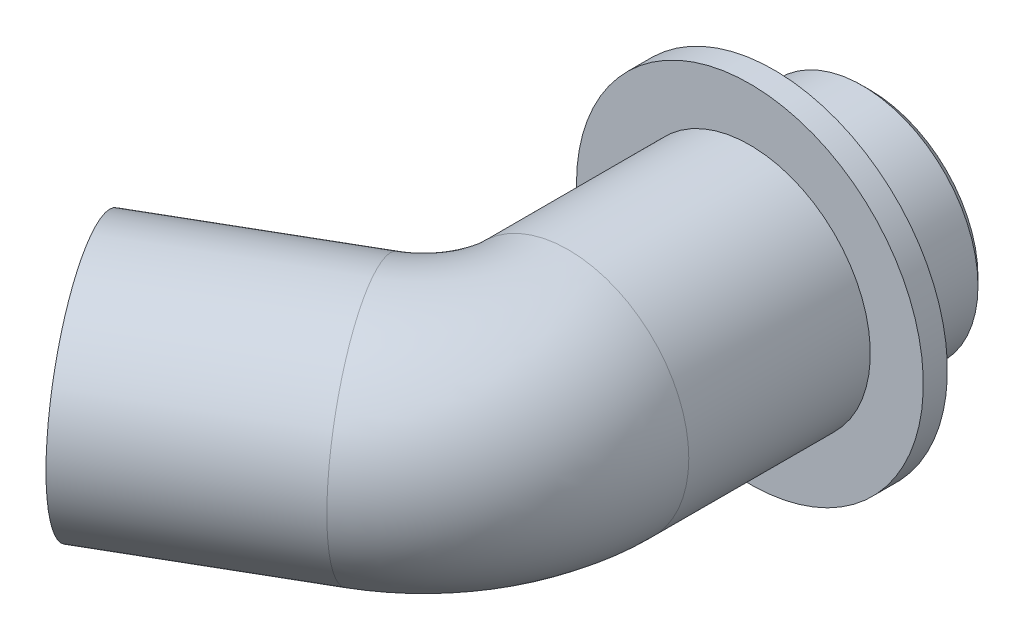
ISO-10303-21;
HEADER;
FILE_DESCRIPTION(('STEP AP214'),'2;1');
FILE_NAME('part.step','',(''),(''),'','','');
FILE_SCHEMA(('AUTOMOTIVE_DESIGN { 1 0 10303 214 1 1 1 1 }'));
ENDSEC;
DATA;
#1=APPLICATION_CONTEXT('core data for automotive mechanical design processes');
#2=APPLICATION_PROTOCOL_DEFINITION('international standard','automotive_design',2000,#1);
#3=PRODUCT_CONTEXT('',#1,'mechanical');
#4=PRODUCT('Part','Part','',(#3));
#5=PRODUCT_RELATED_PRODUCT_CATEGORY('part','',(#4));
#6=PRODUCT_DEFINITION_FORMATION('','',#4);
#7=PRODUCT_DEFINITION_CONTEXT('part definition',#1,'design');
#8=PRODUCT_DEFINITION('design','',#6,#7);
#9=PRODUCT_DEFINITION_SHAPE('','',#8);
#10=(LENGTH_UNIT() NAMED_UNIT(*) SI_UNIT(.MILLI.,.METRE.));
#11=(NAMED_UNIT(*) PLANE_ANGLE_UNIT() SI_UNIT($,.RADIAN.));
#12=(NAMED_UNIT(*) SI_UNIT($,.STERADIAN.) SOLID_ANGLE_UNIT());
#13=UNCERTAINTY_MEASURE_WITH_UNIT(LENGTH_MEASURE(1.E-05),#10,'distance_accuracy_value','');
#14=(GEOMETRIC_REPRESENTATION_CONTEXT(3) GLOBAL_UNCERTAINTY_ASSIGNED_CONTEXT((#13)) GLOBAL_UNIT_ASSIGNED_CONTEXT((#10,
#11,#12)) REPRESENTATION_CONTEXT('',''));
#15=CARTESIAN_POINT('',(0.,0.,0.));
#16=DIRECTION('',(0.,0.,1.));
#17=DIRECTION('',(1.,0.,0.));
#18=AXIS2_PLACEMENT_3D('',#15,#16,#17);
#19=CARTESIAN_POINT('',(0.,0.,0.));
#20=DIRECTION('',(0.,0.,0.999999999999976));
#21=DIRECTION('',(0.999999999999988,0.,0.));
#22=AXIS2_PLACEMENT_3D('',#19,#20,#21);
#23=PLANE('',#22);
#24=CARTESIAN_POINT('',(0.,0.,0.));
#25=DIRECTION('',(0.,0.,0.999999999999976));
#26=DIRECTION('',(0.999999999999988,0.,0.));
#27=AXIS2_PLACEMENT_3D('',#24,#25,#26);
#28=CIRCLE('',#27,22.352);
#29=CARTESIAN_POINT('',(22.3519999999997,0.,0.));
#30=VERTEX_POINT('',#29);
#31=EDGE_CURVE('E53',#30,#30,#28,.F.);
#32=ORIENTED_EDGE('',*,*,#31,.T.);
#33=EDGE_LOOP('',(#32));
#34=FACE_BOUND('',#33,.T.);
#35=CARTESIAN_POINT('',(0.,0.,0.));
#36=DIRECTION('',(0.,0.,0.999999999999976));
#37=DIRECTION('',(0.999999999999988,0.,0.));
#38=AXIS2_PLACEMENT_3D('',#35,#36,#37);
#39=CIRCLE('',#38,15.);
#40=CARTESIAN_POINT('',(14.9999999999998,0.,0.));
#41=VERTEX_POINT('',#40);
#42=EDGE_CURVE('E76',#41,#41,#39,.T.);
#43=ORIENTED_EDGE('',*,*,#42,.T.);
#44=EDGE_LOOP('',(#43));
#45=FACE_BOUND('',#44,.T.);
#46=ADVANCED_FACE('F46',(#34,#45),#23,.F.);
#47=CARTESIAN_POINT('',(22.,0.,15.9999999999992));
#48=DIRECTION('',(0.,0.,0.999999999999976));
#49=DIRECTION('',(0.999999999999988,0.,0.));
#50=AXIS2_PLACEMENT_3D('',#47,#48,#49);
#51=PLANE('',#50);
#52=CARTESIAN_POINT('',(5.48172618408671E-13,0.,16.));
#53=DIRECTION('',(0.,0.,-0.999999999999976));
#54=DIRECTION('',(-0.999999999999988,0.,0.));
#55=AXIS2_PLACEMENT_3D('',#52,#53,#54);
#56=CIRCLE('',#55,22.);
#57=CARTESIAN_POINT('',(-21.9999999999997,0.,16.));
#58=VERTEX_POINT('',#57);
#59=EDGE_CURVE('E93',#58,#58,#56,.T.);
#60=ORIENTED_EDGE('',*,*,#59,.T.);
#61=EDGE_LOOP('',(#60));
#62=FACE_BOUND('',#61,.T.);
#63=CARTESIAN_POINT('',(5.48172618408671E-13,0.,16.));
#64=DIRECTION('',(0.,0.,0.999999999999976));
#65=DIRECTION('',(0.999999999999988,0.,0.));
#66=AXIS2_PLACEMENT_3D('',#63,#64,#65);
#67=CIRCLE('',#66,24.);
#68=CARTESIAN_POINT('',(-23.9999999999997,0.,16.));
#69=VERTEX_POINT('',#68);
#70=EDGE_CURVE('E96',#69,#69,#67,.F.);
#71=ORIENTED_EDGE('',*,*,#70,.F.);
#72=EDGE_LOOP('',(#71));
#73=FACE_BOUND('',#72,.T.);
#74=ADVANCED_FACE('F102',(#62,#73),#51,.T.);
#75=CARTESIAN_POINT('',(5.55111512312578E-13,0.,62.6794919243098));
#76=DIRECTION('',(0.,0.,-0.999999999999976));
#77=DIRECTION('',(-0.999999999999988,0.,0.));
#78=AXIS2_PLACEMENT_3D('',#75,#76,#77);
#79=CYLINDRICAL_SURFACE('',#78,25.);
#80=CARTESIAN_POINT('',(5.55111512312578E-13,0.,62.6794919243098));
#81=DIRECTION('',(0.,0.,0.999999999999976));
#82=DIRECTION('',(0.999999999999988,0.,0.));
#83=AXIS2_PLACEMENT_3D('',#80,#81,#82);
#84=CIRCLE('',#83,25.);
#85=CARTESIAN_POINT('',(25.0000000000007,0.,62.679491924311));
#86=VERTEX_POINT('',#85);
#87=EDGE_CURVE('E75',#86,#86,#84,.T.);
#88=ORIENTED_EDGE('',*,*,#87,.F.);
#89=EDGE_LOOP('',(#88));
#90=FACE_BOUND('',#89,.T.);
#91=CARTESIAN_POINT('',(5.48172618408671E-13,0.,24.9999999999985));
#92=DIRECTION('',(0.,0.,-0.999999999999976));
#93=DIRECTION('',(-0.999999999999988,0.,0.));
#94=AXIS2_PLACEMENT_3D('',#91,#92,#93);
#95=CIRCLE('',#94,25.);
#96=CARTESIAN_POINT('',(-24.9999999999991,0.,24.9999999999985));
#97=VERTEX_POINT('',#96);
#98=EDGE_CURVE('E57',#97,#97,#95,.T.);
#99=ORIENTED_EDGE('',*,*,#98,.F.);
#100=EDGE_LOOP('',(#99));
#101=FACE_BOUND('',#100,.T.);
#102=ADVANCED_FACE('F104',(#90,#101),#79,.T.);
#103=CARTESIAN_POINT('',(-14.9999999999996,0.,88.6602540378429));
#104=DIRECTION('',(-0.866025403784426,0.,0.499999999999989));
#105=DIRECTION('',(0.499999999999994,0.,0.866025403784413));
#106=AXIS2_PLACEMENT_3D('',#103,#104,#105);
#107=CYLINDRICAL_SURFACE('',#106,25.);
#108=CARTESIAN_POINT('',(-14.9999999999996,0.,88.6602540378429));
#109=DIRECTION('',(-0.866025403784426,0.,0.499999999999989));
#110=DIRECTION('',(0.499999999999994,0.,0.866025403784413));
#111=AXIS2_PLACEMENT_3D('',#108,#109,#110);
#112=CIRCLE('',#111,25.);
#113=CARTESIAN_POINT('',(-2.49999999999993,0.,110.310889132453));
#114=VERTEX_POINT('',#113);
#115=EDGE_CURVE('E69',#114,#114,#112,.T.);
#116=CARTESIAN_POINT('',(-51.9615242270655,0.,109.999999999997));
#117=DIRECTION('',(-0.866025403784426,0.,0.499999999999989));
#118=DIRECTION('',(0.499999999999994,0.,0.866025403784413));
#119=AXIS2_PLACEMENT_3D('',#116,#117,#118);
#120=CIRCLE('',#119,25.);
#121=CARTESIAN_POINT('',(-39.4615242270654,0.,131.650635094608));
#122=VERTEX_POINT('',#121);
#123=EDGE_CURVE('E61',#122,#122,#120,.T.);
#124=CARTESIAN_POINT('',(-2.49999999999993,0.,110.310889132453));
#125=CARTESIAN_POINT('',(-2.8850158773652,0.,110.533178152892));
#126=CARTESIAN_POINT('',(-3.27003175473046,0.,110.755467173332));
#127=CARTESIAN_POINT('',(-4.040063509461,0.,111.20004521421));
#128=CARTESIAN_POINT('',(-4.42507938682626,0.,111.422334234649));
#129=CARTESIAN_POINT('',(-5.19511114155679,0.,111.866912275527));
#130=CARTESIAN_POINT('',(-5.58012701892206,0.,112.089201295966));
#131=CARTESIAN_POINT('',(-6.35015877365259,0.,112.533779336844));
#132=CARTESIAN_POINT('',(-6.73517465101785,0.,112.756068357284));
#133=CARTESIAN_POINT('',(-7.50520640574838,0.,113.200646398162));
#134=CARTESIAN_POINT('',(-7.89022228311365,0.,113.422935418601));
#135=CARTESIAN_POINT('',(-8.66025403784418,0.,113.867513459479));
#136=CARTESIAN_POINT('',(-9.04526991520945,0.,114.089802479918));
#137=CARTESIAN_POINT('',(-9.81530166993998,0.,114.534380520796));
#138=CARTESIAN_POINT('',(-10.2003175473052,0.,114.756669541236));
#139=CARTESIAN_POINT('',(-10.9703493020358,0.,115.201247582114));
#140=CARTESIAN_POINT('',(-11.355365179401,0.,115.423536602553));
#141=CARTESIAN_POINT('',(-12.1253969341316,0.,115.868114643431));
#142=CARTESIAN_POINT('',(-12.5104128114968,0.,116.09040366387));
#143=CARTESIAN_POINT('',(-13.2804445662274,0.,116.534981704749));
#144=CARTESIAN_POINT('',(-13.6654604435926,0.,116.757270725188));
#145=CARTESIAN_POINT('',(-14.4354921983232,0.,117.201848766066));
#146=CARTESIAN_POINT('',(-14.8205080756884,0.,117.424137786505));
#147=CARTESIAN_POINT('',(-15.590539830419,0.,117.868715827383));
#148=CARTESIAN_POINT('',(-15.9755557077842,0.,118.091004847822));
#149=CARTESIAN_POINT('',(-16.7455874625148,0.,118.535582888701));
#150=CARTESIAN_POINT('',(-17.13060333988,0.,118.75787190914));
#151=CARTESIAN_POINT('',(-17.9006350946106,0.,119.202449950018));
#152=CARTESIAN_POINT('',(-18.2856509719758,0.,119.424738970457));
#153=CARTESIAN_POINT('',(-19.0556827267063,0.,119.869317011335));
#154=CARTESIAN_POINT('',(-19.4406986040716,0.,120.091606031774));
#155=CARTESIAN_POINT('',(-20.2107303588021,0.,120.536184072653));
#156=CARTESIAN_POINT('',(-20.5957462361674,0.,120.758473093092));
#157=CARTESIAN_POINT('',(-21.3657779908979,0.,121.20305113397));
#158=CARTESIAN_POINT('',(-21.7507938682632,0.,121.425340154409));
#159=CARTESIAN_POINT('',(-22.5208256229937,0.,121.869918195287));
#160=CARTESIAN_POINT('',(-22.905841500359,0.,122.092207215726));
#161=CARTESIAN_POINT('',(-23.6758732550895,0.,122.536785256605));
#162=CARTESIAN_POINT('',(-24.0608891324548,0.,122.759074277044));
#163=CARTESIAN_POINT('',(-24.8309208871853,0.,123.203652317922));
#164=CARTESIAN_POINT('',(-25.2159367645506,0.,123.425941338361));
#165=CARTESIAN_POINT('',(-25.9859685192811,0.,123.870519379239));
#166=CARTESIAN_POINT('',(-26.3709843966464,0.,124.092808399678));
#167=CARTESIAN_POINT('',(-27.1410161513769,0.,124.537386440557));
#168=CARTESIAN_POINT('',(-27.5260320287422,0.,124.759675460996));
#169=CARTESIAN_POINT('',(-28.2960637834727,0.,125.204253501874));
#170=CARTESIAN_POINT('',(-28.681079660838,0.,125.426542522313));
#171=CARTESIAN_POINT('',(-29.4511114155685,0.,125.871120563191));
#172=CARTESIAN_POINT('',(-29.8361272929338,0.,126.09340958363));
#173=CARTESIAN_POINT('',(-30.6061590476643,0.,126.537987624509));
#174=CARTESIAN_POINT('',(-30.9911749250296,0.,126.760276644948));
#175=CARTESIAN_POINT('',(-31.7612066797601,0.,127.204854685826));
#176=CARTESIAN_POINT('',(-32.1462225571254,0.,127.427143706265));
#177=CARTESIAN_POINT('',(-32.9162543118559,0.,127.871721747143));
#178=CARTESIAN_POINT('',(-33.3012701892212,0.,128.094010767582));
#179=CARTESIAN_POINT('',(-34.0713019439517,0.,128.538588808461));
#180=CARTESIAN_POINT('',(-34.456317821317,0.,128.7608778289));
#181=CARTESIAN_POINT('',(-35.2263495760475,0.,129.205455869778));
#182=CARTESIAN_POINT('',(-35.6113654534128,0.,129.427744890217));
#183=CARTESIAN_POINT('',(-36.3813972081433,0.,129.872322931095));
#184=CARTESIAN_POINT('',(-36.7664130855086,0.,130.094611951535));
#185=CARTESIAN_POINT('',(-37.5364448402391,0.,130.539189992413));
#186=CARTESIAN_POINT('',(-37.9214607176043,0.,130.761479012852));
#187=CARTESIAN_POINT('',(-38.6914924723349,0.,131.20605705373));
#188=CARTESIAN_POINT('',(-39.0765083497002,0.,131.428346074169));
#189=CARTESIAN_POINT('',(-39.4615242270654,0.,131.650635094608));
#190=B_SPLINE_CURVE_WITH_KNOTS('',3,(#124,#125,#126,#127,#128,#129,#130,#131,#132,#133,#134,
#135,#136,#137,#138,#139,#140,#141,#142,#143,#144,#145,#146,#147,#148,#149,#150,#151,#152,#153,
#154,#155,#156,#157,#158,#159,#160,#161,#162,#163,#164,#165,#166,#167,#168,#169,#170,#171,#172,
#173,#174,#175,#176,#177,#178,#179,#180,#181,#182,#183,#184,#185,#186,#187,#188,#189),
.UNSPECIFIED.,.F.,.F.,(4,2,2,2,2,2,2,2,2,2,2,2,2,2,2,2,2,2,2,2,2,2,2,2,2,2,2,2,2,2,2,2,4),(0.,
1.33373412263469,2.66746824526938,4.00120236790408,5.33493649053877,6.66867061317347,
8.00240473580816,9.33613885844286,10.6698729810775,12.0036071037122,13.3373412263469,
14.6710753489816,16.0048094716163,17.338543594251,18.6722777168857,20.0060118395204,
21.3397459621551,22.6734800847898,24.0072142074245,25.3409483300592,26.6746824526939,
28.0084165753286,29.3421506979633,30.675884820598,32.0096189432326,33.3433530658673,
34.677087188502,36.0108213111367,37.3445554337714,38.6782895564061,40.0120236790408,
41.3457578016755,42.6794919243102),.UNSPECIFIED.);
#191=EDGE_CURVE('BSEAM111',#114,#122,#190,.T.);
#192=ORIENTED_EDGE('',*,*,#115,.T.);
#193=ORIENTED_EDGE('',*,*,#123,.F.);
#194=ORIENTED_EDGE('',*,*,#191,.T.);
#195=ORIENTED_EDGE('',*,*,#191,.F.);
#196=EDGE_LOOP('',(#192,#194,#193,#195));
#197=FACE_BOUND('',#196,.T.);
#198=ADVANCED_FACE('F111',(#197),#107,.T.);
#199=CARTESIAN_POINT('',(-14.9999999999996,0.,88.6602540378429));
#200=DIRECTION('',(-0.866025403784426,0.,0.499999999999989));
#201=DIRECTION('',(0.499999999999994,0.,0.866025403784413));
#202=AXIS2_PLACEMENT_3D('',#199,#200,#201);
#203=CYLINDRICAL_SURFACE('',#202,15.);
#204=CARTESIAN_POINT('',(-14.9999999999996,0.,88.6602540378429));
#205=DIRECTION('',(-0.866025403784426,0.,0.499999999999989));
#206=DIRECTION('',(0.499999999999994,0.,0.866025403784413));
#207=AXIS2_PLACEMENT_3D('',#204,#205,#206);
#208=CIRCLE('',#207,15.);
#209=CARTESIAN_POINT('',(-7.49999999999979,0.,101.650635094609));
#210=VERTEX_POINT('',#209);
#211=EDGE_CURVE('E72',#210,#210,#208,.T.);
#212=CARTESIAN_POINT('',(-51.9615242270655,0.,109.999999999997));
#213=DIRECTION('',(-0.866025403784426,0.,0.499999999999989));
#214=DIRECTION('',(0.499999999999994,0.,0.866025403784413));
#215=AXIS2_PLACEMENT_3D('',#212,#213,#214);
#216=CIRCLE('',#215,15.);
#217=CARTESIAN_POINT('',(-44.4615242270653,0.,122.990381056764));
#218=VERTEX_POINT('',#217);
#219=EDGE_CURVE('E66',#218,#218,#216,.T.);
#220=CARTESIAN_POINT('',(-7.49999999999979,0.,101.650635094609));
#221=CARTESIAN_POINT('',(-7.88501587736505,0.,101.872924115048));
#222=CARTESIAN_POINT('',(-8.27003175473032,0.,102.095213135487));
#223=CARTESIAN_POINT('',(-9.04006350946085,0.,102.539791176366));
#224=CARTESIAN_POINT('',(-9.42507938682612,0.,102.762080196805));
#225=CARTESIAN_POINT('',(-10.1951111415566,0.,103.206658237683));
#226=CARTESIAN_POINT('',(-10.5801270189219,0.,103.428947258122));
#227=CARTESIAN_POINT('',(-11.3501587736524,0.,103.873525299));
#228=CARTESIAN_POINT('',(-11.7351746510177,0.,104.095814319439));
#229=CARTESIAN_POINT('',(-12.5052064057482,0.,104.540392360318));
#230=CARTESIAN_POINT('',(-12.8902222831135,0.,104.762681380757));
#231=CARTESIAN_POINT('',(-13.660254037844,0.,105.207259421635));
#232=CARTESIAN_POINT('',(-14.0452699152093,0.,105.429548442074));
#233=CARTESIAN_POINT('',(-14.8153016699398,0.,105.874126482952));
#234=CARTESIAN_POINT('',(-15.2003175473051,0.,106.096415503391));
#235=CARTESIAN_POINT('',(-15.9703493020356,0.,106.54099354427));
#236=CARTESIAN_POINT('',(-16.3553651794009,0.,106.763282564709));
#237=CARTESIAN_POINT('',(-17.1253969341314,0.,107.207860605587));
#238=CARTESIAN_POINT('',(-17.5104128114967,0.,107.430149626026));
#239=CARTESIAN_POINT('',(-18.2804445662272,0.,107.874727666904));
#240=CARTESIAN_POINT('',(-18.6654604435925,0.,108.097016687343));
#241=CARTESIAN_POINT('',(-19.435492198323,0.,108.541594728222));
#242=CARTESIAN_POINT('',(-19.8205080756883,0.,108.763883748661));
#243=CARTESIAN_POINT('',(-20.5905398304188,0.,109.208461789539));
#244=CARTESIAN_POINT('',(-20.9755557077841,0.,109.430750809978));
#245=CARTESIAN_POINT('',(-21.7455874625146,0.,109.875328850856));
#246=CARTESIAN_POINT('',(-22.1306033398799,0.,110.097617871295));
#247=CARTESIAN_POINT('',(-22.9006350946104,0.,110.542195912174));
#248=CARTESIAN_POINT('',(-23.2856509719757,0.,110.764484932613));
#249=CARTESIAN_POINT('',(-24.0556827267062,0.,111.209062973491));
#250=CARTESIAN_POINT('',(-24.4406986040715,0.,111.43135199393));
#251=CARTESIAN_POINT('',(-25.210730358802,0.,111.875930034808));
#252=CARTESIAN_POINT('',(-25.5957462361673,0.,112.098219055248));
#253=CARTESIAN_POINT('',(-26.3657779908978,0.,112.542797096126));
#254=CARTESIAN_POINT('',(-26.7507938682631,0.,112.765086116565));
#255=CARTESIAN_POINT('',(-27.5208256229936,0.,113.209664157443));
#256=CARTESIAN_POINT('',(-27.9058415003589,0.,113.431953177882));
#257=CARTESIAN_POINT('',(-28.6758732550894,0.,113.87653121876));
#258=CARTESIAN_POINT('',(-29.0608891324547,0.,114.0988202392));
#259=CARTESIAN_POINT('',(-29.8309208871852,0.,114.543398280078));
#260=CARTESIAN_POINT('',(-30.2159367645505,0.,114.765687300517));
#261=CARTESIAN_POINT('',(-30.985968519281,0.,115.210265341395));
#262=CARTESIAN_POINT('',(-31.3709843966462,0.,115.432554361834));
#263=CARTESIAN_POINT('',(-32.1410161513768,0.,115.877132402712));
#264=CARTESIAN_POINT('',(-32.526032028742,0.,116.099421423152));
#265=CARTESIAN_POINT('',(-33.2960637834726,0.,116.54399946403));
#266=CARTESIAN_POINT('',(-33.6810796608378,0.,116.766288484469));
#267=CARTESIAN_POINT('',(-34.4511114155684,0.,117.210866525347));
#268=CARTESIAN_POINT('',(-34.8361272929336,0.,117.433155545786));
#269=CARTESIAN_POINT('',(-35.6061590476642,0.,117.877733586664));
#270=CARTESIAN_POINT('',(-35.9911749250294,0.,118.100022607104));
#271=CARTESIAN_POINT('',(-36.76120667976,0.,118.544600647982));
#272=CARTESIAN_POINT('',(-37.1462225571252,0.,118.766889668421));
#273=CARTESIAN_POINT('',(-37.9162543118558,0.,119.211467709299));
#274=CARTESIAN_POINT('',(-38.301270189221,0.,119.433756729738));
#275=CARTESIAN_POINT('',(-39.0713019439516,0.,119.878334770617));
#276=CARTESIAN_POINT('',(-39.4563178213168,0.,120.100623791056));
#277=CARTESIAN_POINT('',(-40.2263495760474,0.,120.545201831934));
#278=CARTESIAN_POINT('',(-40.6113654534126,0.,120.767490852373));
#279=CARTESIAN_POINT('',(-41.3813972081432,0.,121.212068893251));
#280=CARTESIAN_POINT('',(-41.7664130855084,0.,121.43435791369));
#281=CARTESIAN_POINT('',(-42.5364448402389,0.,121.878935954569));
#282=CARTESIAN_POINT('',(-42.9214607176042,0.,122.101224975008));
#283=CARTESIAN_POINT('',(-43.6914924723347,0.,122.545803015886));
#284=CARTESIAN_POINT('',(-44.0765083497,0.,122.768092036325));
#285=CARTESIAN_POINT('',(-44.4615242270653,0.,122.990381056764));
#286=B_SPLINE_CURVE_WITH_KNOTS('',3,(#220,#221,#222,#223,#224,#225,#226,#227,#228,#229,#230,
#231,#232,#233,#234,#235,#236,#237,#238,#239,#240,#241,#242,#243,#244,#245,#246,#247,#248,#249,
#250,#251,#252,#253,#254,#255,#256,#257,#258,#259,#260,#261,#262,#263,#264,#265,#266,#267,#268,
#269,#270,#271,#272,#273,#274,#275,#276,#277,#278,#279,#280,#281,#282,#283,#284,#285),
.UNSPECIFIED.,.F.,.F.,(4,2,2,2,2,2,2,2,2,2,2,2,2,2,2,2,2,2,2,2,2,2,2,2,2,2,2,2,2,2,2,2,4),(0.,
1.33373412263469,2.66746824526939,4.00120236790408,5.33493649053877,6.66867061317346,
8.00240473580816,9.33613885844285,10.6698729810775,12.0036071037122,13.3373412263469,
14.6710753489816,16.0048094716163,17.338543594251,18.6722777168857,20.0060118395204,
21.3397459621551,22.6734800847898,24.0072142074245,25.3409483300592,26.6746824526939,
28.0084165753285,29.3421506979632,30.6758848205979,32.0096189432326,33.3433530658673,
34.677087188502,36.0108213111367,37.3445554337714,38.6782895564061,40.0120236790408,
41.3457578016755,42.6794919243102),.UNSPECIFIED.);
#287=EDGE_CURVE('BSEAM148',#210,#218,#286,.T.);
#288=ORIENTED_EDGE('',*,*,#211,.F.);
#289=ORIENTED_EDGE('',*,*,#219,.T.);
#290=ORIENTED_EDGE('',*,*,#287,.T.);
#291=ORIENTED_EDGE('',*,*,#287,.F.);
#292=EDGE_LOOP('',(#288,#290,#289,#291));
#293=FACE_BOUND('',#292,.T.);
#294=ADVANCED_FACE('F148',(#293),#203,.F.);
#295=CARTESIAN_POINT('',(-29.9999999999993,0.,62.6794919243083));
#296=DIRECTION('',(0.,-0.999999999999988,0.));
#297=DIRECTION('',(0.,0.,-0.999999999999976));
#298=AXIS2_PLACEMENT_3D('',#295,#296,#297);
#299=TOROIDAL_SURFACE('',#298,30.,25.);
#300=CARTESIAN_POINT('',(-29.9999999999993,0.,62.6794919243083));
#301=DIRECTION('',(0.,-0.999999999999988,0.));
#302=DIRECTION('',(0.,0.,-0.999999999999976));
#303=AXIS2_PLACEMENT_3D('',#300,#301,#302);
#304=CIRCLE('',#303,55.);
#305=EDGE_CURVE('',#86,#114,#304,.T.);
#306=ORIENTED_EDGE('',*,*,#87,.T.);
#307=ORIENTED_EDGE('',*,*,#115,.F.);
#308=ORIENTED_EDGE('',*,*,#305,.T.);
#309=ORIENTED_EDGE('',*,*,#305,.F.);
#310=EDGE_LOOP('',(#306,#308,#307,#309));
#311=FACE_BOUND('',#310,.T.);
#312=ADVANCED_FACE('F144',(#311),#299,.T.);
#313=CARTESIAN_POINT('',(-29.9999999999993,0.,62.6794919243083));
#314=DIRECTION('',(0.,-0.999999999999988,0.));
#315=DIRECTION('',(0.,0.,-0.999999999999976));
#316=AXIS2_PLACEMENT_3D('',#313,#314,#315);
#317=TOROIDAL_SURFACE('',#316,30.,15.);
#318=CARTESIAN_POINT('',(5.55111512312578E-13,0.,62.6794919243098));
#319=DIRECTION('',(0.,0.,0.999999999999976));
#320=DIRECTION('',(0.999999999999988,0.,0.));
#321=AXIS2_PLACEMENT_3D('',#318,#319,#320);
#322=CIRCLE('',#321,15.);
#323=CARTESIAN_POINT('',(15.0000000000007,0.,62.6794919243105));
#324=VERTEX_POINT('',#323);
#325=EDGE_CURVE('E79',#324,#324,#322,.T.);
#326=CARTESIAN_POINT('',(-29.9999999999993,0.,62.6794919243083));
#327=DIRECTION('',(0.,-0.999999999999988,0.));
#328=DIRECTION('',(0.,0.,-0.999999999999976));
#329=AXIS2_PLACEMENT_3D('',#326,#327,#328);
#330=CIRCLE('',#329,45.);
#331=EDGE_CURVE('',#324,#210,#330,.T.);
#332=ORIENTED_EDGE('',*,*,#325,.F.);
#333=ORIENTED_EDGE('',*,*,#211,.T.);
#334=ORIENTED_EDGE('',*,*,#331,.T.);
#335=ORIENTED_EDGE('',*,*,#331,.F.);
#336=EDGE_LOOP('',(#332,#334,#333,#335));
#337=FACE_BOUND('',#336,.T.);
#338=ADVANCED_FACE('F140',(#337),#317,.F.);
#339=CARTESIAN_POINT('',(5.55111512312578E-13,0.,62.6794919243098));
#340=DIRECTION('',(0.,0.,-0.999999999999976));
#341=DIRECTION('',(-0.999999999999988,0.,0.));
#342=AXIS2_PLACEMENT_3D('',#339,#340,#341);
#343=CYLINDRICAL_SURFACE('',#342,15.);
#344=ORIENTED_EDGE('',*,*,#325,.T.);
#345=EDGE_LOOP('',(#344));
#346=FACE_BOUND('',#345,.T.);
#347=ORIENTED_EDGE('',*,*,#42,.F.);
#348=EDGE_LOOP('',(#347));
#349=FACE_BOUND('',#348,.T.);
#350=ADVANCED_FACE('F135',(#346,#349),#343,.F.);
#351=CARTESIAN_POINT('',(-51.9615242270655,0.,109.999999999997));
#352=DIRECTION('',(-0.866025403784426,0.,0.499999999999989));
#353=DIRECTION('',(0.499999999999994,0.,0.866025403784413));
#354=AXIS2_PLACEMENT_3D('',#351,#352,#353);
#355=PLANE('',#354);
#356=ORIENTED_EDGE('',*,*,#219,.F.);
#357=EDGE_LOOP('',(#356));
#358=FACE_BOUND('',#357,.T.);
#359=ORIENTED_EDGE('',*,*,#123,.T.);
#360=EDGE_LOOP('',(#359));
#361=FACE_BOUND('',#360,.T.);
#362=ADVANCED_FACE('F132',(#358,#361),#355,.T.);
#363=CARTESIAN_POINT('',(5.48172618408671E-13,0.,24.9999999999985));
#364=DIRECTION('',(0.,0.,-0.999999999999976));
#365=DIRECTION('',(-0.999999999999988,0.,0.));
#366=AXIS2_PLACEMENT_3D('',#363,#364,#365);
#367=CYLINDRICAL_SURFACE('',#366,36.);
#368=CARTESIAN_POINT('',(5.48172618408671E-13,0.,24.9999999999985));
#369=DIRECTION('',(0.,0.,-0.999999999999976));
#370=DIRECTION('',(-0.999999999999988,0.,0.));
#371=AXIS2_PLACEMENT_3D('',#368,#369,#370);
#372=CIRCLE('',#371,36.);
#373=CARTESIAN_POINT('',(-35.999999999999,0.,24.9999999999985));
#374=VERTEX_POINT('',#373);
#375=EDGE_CURVE('E80',#374,#374,#372,.T.);
#376=CARTESIAN_POINT('',(1.66533453693773E-13,0.,19.9999999999992));
#377=DIRECTION('',(0.,0.,-0.999999999999976));
#378=DIRECTION('',(-0.999999999999988,0.,0.));
#379=AXIS2_PLACEMENT_3D('',#376,#377,#378);
#380=CIRCLE('',#379,36.);
#381=CARTESIAN_POINT('',(-35.999999999999,0.,19.9999999999992));
#382=VERTEX_POINT('',#381);
#383=EDGE_CURVE('E85',#382,#382,#380,.T.);
#384=CARTESIAN_POINT('',(-35.999999999999,0.,24.9999999999985));
#385=CARTESIAN_POINT('',(-35.999999999999,0.,24.9479166666652));
#386=CARTESIAN_POINT('',(-35.999999999999,0.,24.8958333333318));
#387=CARTESIAN_POINT('',(-35.999999999999,0.,24.7916666666652));
#388=CARTESIAN_POINT('',(-35.999999999999,0.,24.7395833333319));
#389=CARTESIAN_POINT('',(-35.999999999999,0.,24.6354166666652));
#390=CARTESIAN_POINT('',(-35.999999999999,0.,24.5833333333319));
#391=CARTESIAN_POINT('',(-35.999999999999,0.,24.4791666666652));
#392=CARTESIAN_POINT('',(-35.999999999999,0.,24.4270833333319));
#393=CARTESIAN_POINT('',(-35.999999999999,0.,24.3229166666653));
#394=CARTESIAN_POINT('',(-35.999999999999,0.,24.2708333333319));
#395=CARTESIAN_POINT('',(-35.999999999999,0.,24.1666666666653));
#396=CARTESIAN_POINT('',(-35.999999999999,0.,24.114583333332));
#397=CARTESIAN_POINT('',(-35.999999999999,0.,24.0104166666653));
#398=CARTESIAN_POINT('',(-35.999999999999,0.,23.958333333332));
#399=CARTESIAN_POINT('',(-35.999999999999,0.,23.8541666666653));
#400=CARTESIAN_POINT('',(-35.999999999999,0.,23.802083333332));
#401=CARTESIAN_POINT('',(-35.999999999999,0.,23.6979166666654));
#402=CARTESIAN_POINT('',(-35.999999999999,0.,23.645833333332));
#403=CARTESIAN_POINT('',(-35.999999999999,0.,23.5416666666654));
#404=CARTESIAN_POINT('',(-35.999999999999,0.,23.489583333332));
#405=CARTESIAN_POINT('',(-35.999999999999,0.,23.3854166666654));
#406=CARTESIAN_POINT('',(-35.999999999999,0.,23.3333333333321));
#407=CARTESIAN_POINT('',(-35.999999999999,0.,23.2291666666654));
#408=CARTESIAN_POINT('',(-35.999999999999,0.,23.1770833333321));
#409=CARTESIAN_POINT('',(-35.999999999999,0.,23.0729166666654));
#410=CARTESIAN_POINT('',(-35.999999999999,0.,23.0208333333321));
#411=CARTESIAN_POINT('',(-35.999999999999,0.,22.9166666666655));
#412=CARTESIAN_POINT('',(-35.999999999999,0.,22.8645833333321));
#413=CARTESIAN_POINT('',(-35.999999999999,0.,22.7604166666655));
#414=CARTESIAN_POINT('',(-35.999999999999,0.,22.7083333333322));
#415=CARTESIAN_POINT('',(-35.999999999999,0.,22.6041666666655));
#416=CARTESIAN_POINT('',(-35.999999999999,0.,22.5520833333322));
#417=CARTESIAN_POINT('',(-35.999999999999,0.,22.4479166666655));
#418=CARTESIAN_POINT('',(-35.999999999999,0.,22.3958333333322));
#419=CARTESIAN_POINT('',(-35.999999999999,0.,22.2916666666656));
#420=CARTESIAN_POINT('',(-35.999999999999,0.,22.2395833333322));
#421=CARTESIAN_POINT('',(-35.999999999999,0.,22.1354166666656));
#422=CARTESIAN_POINT('',(-35.999999999999,0.,22.0833333333323));
#423=CARTESIAN_POINT('',(-35.999999999999,0.,21.9791666666656));
#424=CARTESIAN_POINT('',(-35.999999999999,0.,21.9270833333323));
#425=CARTESIAN_POINT('',(-35.999999999999,0.,21.8229166666656));
#426=CARTESIAN_POINT('',(-35.999999999999,0.,21.7708333333323));
#427=CARTESIAN_POINT('',(-35.999999999999,0.,21.6666666666657));
#428=CARTESIAN_POINT('',(-35.999999999999,0.,21.6145833333323));
#429=CARTESIAN_POINT('',(-35.999999999999,0.,21.5104166666657));
#430=CARTESIAN_POINT('',(-35.999999999999,0.,21.4583333333324));
#431=CARTESIAN_POINT('',(-35.999999999999,0.,21.3541666666657));
#432=CARTESIAN_POINT('',(-35.999999999999,0.,21.3020833333324));
#433=CARTESIAN_POINT('',(-35.999999999999,0.,21.1979166666657));
#434=CARTESIAN_POINT('',(-35.999999999999,0.,21.1458333333324));
#435=CARTESIAN_POINT('',(-35.999999999999,0.,21.0416666666658));
#436=CARTESIAN_POINT('',(-35.999999999999,0.,20.9895833333324));
#437=CARTESIAN_POINT('',(-35.999999999999,0.,20.8854166666658));
#438=CARTESIAN_POINT('',(-35.999999999999,0.,20.8333333333324));
#439=CARTESIAN_POINT('',(-35.999999999999,0.,20.7291666666658));
#440=CARTESIAN_POINT('',(-35.999999999999,0.,20.6770833333325));
#441=CARTESIAN_POINT('',(-35.999999999999,0.,20.5729166666658));
#442=CARTESIAN_POINT('',(-35.999999999999,0.,20.5208333333325));
#443=CARTESIAN_POINT('',(-35.999999999999,0.,20.4166666666658));
#444=CARTESIAN_POINT('',(-35.999999999999,0.,20.3645833333325));
#445=CARTESIAN_POINT('',(-35.999999999999,0.,20.2604166666659));
#446=CARTESIAN_POINT('',(-35.999999999999,0.,20.2083333333325));
#447=CARTESIAN_POINT('',(-35.999999999999,0.,20.1041666666659));
#448=CARTESIAN_POINT('',(-35.999999999999,0.,20.0520833333326));
#449=CARTESIAN_POINT('',(-35.999999999999,0.,19.9999999999992));
#450=B_SPLINE_CURVE_WITH_KNOTS('',3,(#384,#385,#386,#387,#388,#389,#390,#391,#392,#393,#394,
#395,#396,#397,#398,#399,#400,#401,#402,#403,#404,#405,#406,#407,#408,#409,#410,#411,#412,#413,
#414,#415,#416,#417,#418,#419,#420,#421,#422,#423,#424,#425,#426,#427,#428,#429,#430,#431,#432,
#433,#434,#435,#436,#437,#438,#439,#440,#441,#442,#443,#444,#445,#446,#447,#448,#449),
.UNSPECIFIED.,.F.,.F.,(4,2,2,2,2,2,2,2,2,2,2,2,2,2,2,2,2,2,2,2,2,2,2,2,2,2,2,2,2,2,2,2,4),(0.,
0.156249999999976,0.312499999999952,0.468749999999928,0.624999999999907,0.781249999999883,
0.937499999999859,1.09374999999983,1.24999999999981,1.40624999999979,1.56249999999977,
1.71874999999974,1.87499999999972,2.0312499999997,2.18749999999967,2.34374999999965,
2.49999999999963,2.6562499999996,2.81249999999958,2.96874999999956,3.12499999999953,
3.28124999999951,3.43749999999949,3.59374999999946,3.74999999999944,3.90624999999942,
4.06249999999939,4.21874999999937,4.37499999999935,4.53124999999932,4.6874999999993,
4.84374999999928,4.99999999999925),.UNSPECIFIED.);
#451=EDGE_CURVE('BSEAM125',#374,#382,#450,.T.);
#452=ORIENTED_EDGE('',*,*,#375,.T.);
#453=ORIENTED_EDGE('',*,*,#383,.F.);
#454=ORIENTED_EDGE('',*,*,#451,.T.);
#455=ORIENTED_EDGE('',*,*,#451,.F.);
#456=EDGE_LOOP('',(#452,#454,#453,#455));
#457=FACE_BOUND('',#456,.T.);
#458=ADVANCED_FACE('F125',(#457),#367,.T.);
#459=CARTESIAN_POINT('',(5.48172618408671E-13,0.,24.9999999999985));
#460=DIRECTION('',(0.,0.,-0.999999999999976));
#461=DIRECTION('',(-0.999999999999988,0.,0.));
#462=AXIS2_PLACEMENT_3D('',#459,#460,#461);
#463=PLANE('',#462);
#464=ORIENTED_EDGE('',*,*,#98,.T.);
#465=EDGE_LOOP('',(#464));
#466=FACE_BOUND('',#465,.T.);
#467=ORIENTED_EDGE('',*,*,#375,.F.);
#468=EDGE_LOOP('',(#467));
#469=FACE_BOUND('',#468,.T.);
#470=ADVANCED_FACE('F122',(#466,#469),#463,.F.);
#471=CARTESIAN_POINT('',(1.66533453693773E-13,0.,19.9999999999992));
#472=DIRECTION('',(0.,0.,-0.999999999999976));
#473=DIRECTION('',(-0.999999999999988,0.,0.));
#474=AXIS2_PLACEMENT_3D('',#471,#472,#473);
#475=PLANE('',#474);
#476=ORIENTED_EDGE('',*,*,#383,.T.);
#477=EDGE_LOOP('',(#476));
#478=FACE_BOUND('',#477,.T.);
#479=CARTESIAN_POINT('',(1.66533453693773E-13,0.,19.9999999999992));
#480=DIRECTION('',(0.,0.,-0.999999999999976));
#481=DIRECTION('',(-0.999999999999988,0.,0.));
#482=AXIS2_PLACEMENT_3D('',#479,#480,#481);
#483=CIRCLE('',#482,22.);
#484=CARTESIAN_POINT('',(-21.9999999999997,0.,19.9999999999992));
#485=VERTEX_POINT('',#484);
#486=EDGE_CURVE('E88',#485,#485,#483,.T.);
#487=ORIENTED_EDGE('',*,*,#486,.F.);
#488=EDGE_LOOP('',(#487));
#489=FACE_BOUND('',#488,.T.);
#490=ADVANCED_FACE('F120',(#478,#489),#475,.T.);
#491=CARTESIAN_POINT('',(0.,0.,0.));
#492=DIRECTION('',(0.,0.,-0.999999999999976));
#493=DIRECTION('',(-0.999999999999988,0.,0.));
#494=AXIS2_PLACEMENT_3D('',#491,#492,#493);
#495=CYLINDRICAL_SURFACE('',#494,22.);
#496=CARTESIAN_POINT('',(-21.9999999999997,0.,19.9999999999992));
#497=CARTESIAN_POINT('',(-21.9999999999997,0.,19.9583333333326));
#498=CARTESIAN_POINT('',(-21.9999999999997,0.,19.9166666666659));
#499=CARTESIAN_POINT('',(-21.9999999999997,0.,19.8333333333326));
#500=CARTESIAN_POINT('',(-21.9999999999997,0.,19.7916666666659));
#501=CARTESIAN_POINT('',(-21.9999999999997,0.,19.7083333333326));
#502=CARTESIAN_POINT('',(-21.9999999999997,0.,19.666666666666));
#503=CARTESIAN_POINT('',(-21.9999999999997,0.,19.5833333333327));
#504=CARTESIAN_POINT('',(-21.9999999999997,0.,19.541666666666));
#505=CARTESIAN_POINT('',(-21.9999999999997,0.,19.4583333333327));
#506=CARTESIAN_POINT('',(-21.9999999999997,0.,19.416666666666));
#507=CARTESIAN_POINT('',(-21.9999999999997,0.,19.3333333333327));
#508=CARTESIAN_POINT('',(-21.9999999999997,0.,19.291666666666));
#509=CARTESIAN_POINT('',(-21.9999999999997,0.,19.2083333333327));
#510=CARTESIAN_POINT('',(-21.9999999999997,0.,19.1666666666661));
#511=CARTESIAN_POINT('',(-21.9999999999997,0.,19.0833333333327));
#512=CARTESIAN_POINT('',(-21.9999999999997,0.,19.0416666666661));
#513=CARTESIAN_POINT('',(-21.9999999999997,0.,18.9583333333328));
#514=CARTESIAN_POINT('',(-21.9999999999997,0.,18.9166666666661));
#515=CARTESIAN_POINT('',(-21.9999999999997,0.,18.8333333333328));
#516=CARTESIAN_POINT('',(-21.9999999999997,0.,18.7916666666661));
#517=CARTESIAN_POINT('',(-21.9999999999997,0.,18.7083333333328));
#518=CARTESIAN_POINT('',(-21.9999999999997,0.,18.6666666666662));
#519=CARTESIAN_POINT('',(-21.9999999999997,0.,18.5833333333328));
#520=CARTESIAN_POINT('',(-21.9999999999997,0.,18.5416666666662));
#521=CARTESIAN_POINT('',(-21.9999999999997,0.,18.4583333333329));
#522=CARTESIAN_POINT('',(-21.9999999999997,0.,18.4166666666662));
#523=CARTESIAN_POINT('',(-21.9999999999997,0.,18.3333333333329));
#524=CARTESIAN_POINT('',(-21.9999999999997,0.,18.2916666666662));
#525=CARTESIAN_POINT('',(-21.9999999999997,0.,18.2083333333329));
#526=CARTESIAN_POINT('',(-21.9999999999997,0.,18.1666666666663));
#527=CARTESIAN_POINT('',(-21.9999999999997,0.,18.0833333333329));
#528=CARTESIAN_POINT('',(-21.9999999999997,0.,18.0416666666663));
#529=CARTESIAN_POINT('',(-21.9999999999997,0.,17.958333333333));
#530=CARTESIAN_POINT('',(-21.9999999999997,0.,17.9166666666663));
#531=CARTESIAN_POINT('',(-21.9999999999997,0.,17.833333333333));
#532=CARTESIAN_POINT('',(-21.9999999999997,0.,17.7916666666663));
#533=CARTESIAN_POINT('',(-21.9999999999997,0.,17.708333333333));
#534=CARTESIAN_POINT('',(-21.9999999999997,0.,17.6666666666664));
#535=CARTESIAN_POINT('',(-21.9999999999997,0.,17.583333333333));
#536=CARTESIAN_POINT('',(-21.9999999999997,0.,17.5416666666664));
#537=CARTESIAN_POINT('',(-21.9999999999997,0.,17.4583333333331));
#538=CARTESIAN_POINT('',(-21.9999999999997,0.,17.4166666666664));
#539=CARTESIAN_POINT('',(-21.9999999999997,0.,17.3333333333331));
#540=CARTESIAN_POINT('',(-21.9999999999997,0.,17.2916666666664));
#541=CARTESIAN_POINT('',(-21.9999999999997,0.,17.2083333333331));
#542=CARTESIAN_POINT('',(-21.9999999999997,0.,17.1666666666664));
#543=CARTESIAN_POINT('',(-21.9999999999997,0.,17.0833333333331));
#544=CARTESIAN_POINT('',(-21.9999999999997,0.,17.0416666666665));
#545=CARTESIAN_POINT('',(-21.9999999999997,0.,16.9583333333332));
#546=CARTESIAN_POINT('',(-21.9999999999997,0.,16.9166666666665));
#547=CARTESIAN_POINT('',(-21.9999999999997,0.,16.8333333333332));
#548=CARTESIAN_POINT('',(-21.9999999999997,0.,16.7916666666665));
#549=CARTESIAN_POINT('',(-21.9999999999997,0.,16.7083333333332));
#550=CARTESIAN_POINT('',(-21.9999999999997,0.,16.6666666666665));
#551=CARTESIAN_POINT('',(-21.9999999999997,0.,16.5833333333332));
#552=CARTESIAN_POINT('',(-21.9999999999997,0.,16.5416666666666));
#553=CARTESIAN_POINT('',(-21.9999999999997,0.,16.4583333333332));
#554=CARTESIAN_POINT('',(-21.9999999999997,0.,16.4166666666666));
#555=CARTESIAN_POINT('',(-21.9999999999997,0.,16.3333333333333));
#556=CARTESIAN_POINT('',(-21.9999999999997,0.,16.2916666666666));
#557=CARTESIAN_POINT('',(-21.9999999999997,0.,16.2083333333333));
#558=CARTESIAN_POINT('',(-21.9999999999997,0.,16.1666666666666));
#559=CARTESIAN_POINT('',(-21.9999999999997,0.,16.0833333333333));
#560=CARTESIAN_POINT('',(-21.9999999999997,0.,16.0416666666667));
#561=CARTESIAN_POINT('',(-21.9999999999997,0.,16.));
#562=B_SPLINE_CURVE_WITH_KNOTS('',3,(#496,#497,#498,#499,#500,#501,#502,#503,#504,#505,#506,
#507,#508,#509,#510,#511,#512,#513,#514,#515,#516,#517,#518,#519,#520,#521,#522,#523,#524,#525,
#526,#527,#528,#529,#530,#531,#532,#533,#534,#535,#536,#537,#538,#539,#540,#541,#542,#543,#544,
#545,#546,#547,#548,#549,#550,#551,#552,#553,#554,#555,#556,#557,#558,#559,#560,#561),
.UNSPECIFIED.,.F.,.F.,(4,2,2,2,2,2,2,2,2,2,2,2,2,2,2,2,2,2,2,2,2,2,2,2,2,2,2,2,2,2,2,2,4),(0.,
0.124999999999976,0.249999999999952,0.374999999999928,0.499999999999903,0.624999999999879,
0.749999999999858,0.874999999999834,0.99999999999981,1.12499999999979,1.24999999999976,
1.37499999999974,1.49999999999971,1.62499999999969,1.74999999999966,1.87499999999964,
1.99999999999962,2.1249999999996,2.24999999999957,2.37499999999955,2.49999999999952,
2.6249999999995,2.74999999999948,2.87499999999945,2.99999999999943,3.12499999999941,
3.24999999999938,3.37499999999936,3.49999999999933,3.62499999999931,3.74999999999929,
3.87499999999926,3.99999999999924),.UNSPECIFIED.);
#563=EDGE_CURVE('BSEAM117',#485,#58,#562,.T.);
#564=ORIENTED_EDGE('',*,*,#486,.T.);
#565=ORIENTED_EDGE('',*,*,#59,.F.);
#566=ORIENTED_EDGE('',*,*,#563,.T.);
#567=ORIENTED_EDGE('',*,*,#563,.F.);
#568=EDGE_LOOP('',(#564,#566,#565,#567));
#569=FACE_BOUND('',#568,.T.);
#570=ADVANCED_FACE('F117',(#569),#495,.T.);
#571=CARTESIAN_POINT('',(0.,0.,131.651635094608));
#572=DIRECTION('',(0.,0.,-0.999999999999976));
#573=DIRECTION('',(-0.999999999999988,0.,0.));
#574=AXIS2_PLACEMENT_3D('',#571,#572,#573);
#575=CYLINDRICAL_SURFACE('',#574,24.);
#576=CARTESIAN_POINT('',(0.,0.,1.64800000000004));
#577=DIRECTION('',(0.,0.,0.999999999999976));
#578=DIRECTION('',(0.999999999999988,0.,0.));
#579=AXIS2_PLACEMENT_3D('',#576,#577,#578);
#580=CIRCLE('',#579,24.);
#581=CARTESIAN_POINT('',(-23.9999999999997,0.,1.64800000000001));
#582=VERTEX_POINT('',#581);
#583=EDGE_CURVE('E12',#582,#582,#580,.T.);
#584=CARTESIAN_POINT('',(-23.9999999999997,0.,1.64800000000001));
#585=CARTESIAN_POINT('',(-23.9999999999997,0.,1.79750000000002));
#586=CARTESIAN_POINT('',(-23.9999999999997,0.,1.94700000000002));
#587=CARTESIAN_POINT('',(-23.9999999999997,0.,2.24600000000003));
#588=CARTESIAN_POINT('',(-23.9999999999997,0.,2.39550000000002));
#589=CARTESIAN_POINT('',(-23.9999999999997,0.,2.69450000000002));
#590=CARTESIAN_POINT('',(-23.9999999999997,0.,2.84400000000001));
#591=CARTESIAN_POINT('',(-23.9999999999997,0.,3.14300000000002));
#592=CARTESIAN_POINT('',(-23.9999999999997,0.,3.29250000000002));
#593=CARTESIAN_POINT('',(-23.9999999999997,0.,3.59150000000003));
#594=CARTESIAN_POINT('',(-23.9999999999997,0.,3.74100000000002));
#595=CARTESIAN_POINT('',(-23.9999999999997,0.,4.04000000000002));
#596=CARTESIAN_POINT('',(-23.9999999999997,0.,4.18950000000001));
#597=CARTESIAN_POINT('',(-23.9999999999997,0.,4.48850000000002));
#598=CARTESIAN_POINT('',(-23.9999999999997,0.,4.63800000000002));
#599=CARTESIAN_POINT('',(-23.9999999999997,0.,4.93700000000002));
#600=CARTESIAN_POINT('',(-23.9999999999997,0.,5.08650000000002));
#601=CARTESIAN_POINT('',(-23.9999999999997,0.,5.38550000000002));
#602=CARTESIAN_POINT('',(-23.9999999999997,0.,5.53500000000001));
#603=CARTESIAN_POINT('',(-23.9999999999997,0.,5.83400000000001));
#604=CARTESIAN_POINT('',(-23.9999999999997,0.,5.9835));
#605=CARTESIAN_POINT('',(-23.9999999999997,0.,6.28250000000001));
#606=CARTESIAN_POINT('',(-23.9999999999997,0.,6.43200000000001));
#607=CARTESIAN_POINT('',(-23.9999999999997,0.,6.73100000000001));
#608=CARTESIAN_POINT('',(-23.9999999999997,0.,6.88050000000001));
#609=CARTESIAN_POINT('',(-23.9999999999997,0.,7.17950000000002));
#610=CARTESIAN_POINT('',(-23.9999999999997,0.,7.32900000000002));
#611=CARTESIAN_POINT('',(-23.9999999999997,0.,7.62800000000002));
#612=CARTESIAN_POINT('',(-23.9999999999997,0.,7.77750000000002));
#613=CARTESIAN_POINT('',(-23.9999999999997,0.,8.07650000000002));
#614=CARTESIAN_POINT('',(-23.9999999999997,0.,8.22600000000002));
#615=CARTESIAN_POINT('',(-23.9999999999997,0.,8.52500000000002));
#616=CARTESIAN_POINT('',(-23.9999999999997,0.,8.67450000000002));
#617=CARTESIAN_POINT('',(-23.9999999999997,0.,8.97350000000001));
#618=CARTESIAN_POINT('',(-23.9999999999997,0.,9.12300000000001));
#619=CARTESIAN_POINT('',(-23.9999999999997,0.,9.42200000000001));
#620=CARTESIAN_POINT('',(-23.9999999999997,0.,9.57150000000002));
#621=CARTESIAN_POINT('',(-23.9999999999997,0.,9.87050000000002));
#622=CARTESIAN_POINT('',(-23.9999999999997,0.,10.02));
#623=CARTESIAN_POINT('',(-23.9999999999997,0.,10.319));
#624=CARTESIAN_POINT('',(-23.9999999999997,0.,10.4685));
#625=CARTESIAN_POINT('',(-23.9999999999997,0.,10.7675));
#626=CARTESIAN_POINT('',(-23.9999999999997,0.,10.917));
#627=CARTESIAN_POINT('',(-23.9999999999997,0.,11.216));
#628=CARTESIAN_POINT('',(-23.9999999999997,0.,11.3655));
#629=CARTESIAN_POINT('',(-23.9999999999997,0.,11.6645));
#630=CARTESIAN_POINT('',(-23.9999999999997,0.,11.814));
#631=CARTESIAN_POINT('',(-23.9999999999997,0.,12.113));
#632=CARTESIAN_POINT('',(-23.9999999999997,0.,12.2625));
#633=CARTESIAN_POINT('',(-23.9999999999997,0.,12.5615));
#634=CARTESIAN_POINT('',(-23.9999999999997,0.,12.711));
#635=CARTESIAN_POINT('',(-23.9999999999997,0.,13.01));
#636=CARTESIAN_POINT('',(-23.9999999999997,0.,13.1595));
#637=CARTESIAN_POINT('',(-23.9999999999997,0.,13.4585));
#638=CARTESIAN_POINT('',(-23.9999999999997,0.,13.608));
#639=CARTESIAN_POINT('',(-23.9999999999997,0.,13.907));
#640=CARTESIAN_POINT('',(-23.9999999999997,0.,14.0565));
#641=CARTESIAN_POINT('',(-23.9999999999997,0.,14.3555));
#642=CARTESIAN_POINT('',(-23.9999999999997,0.,14.505));
#643=CARTESIAN_POINT('',(-23.9999999999997,0.,14.804));
#644=CARTESIAN_POINT('',(-23.9999999999997,0.,14.9535));
#645=CARTESIAN_POINT('',(-23.9999999999997,0.,15.2525));
#646=CARTESIAN_POINT('',(-23.9999999999997,0.,15.402));
#647=CARTESIAN_POINT('',(-23.9999999999997,0.,15.701));
#648=CARTESIAN_POINT('',(-23.9999999999997,0.,15.8505));
#649=CARTESIAN_POINT('',(-23.9999999999997,0.,16.));
#650=B_SPLINE_CURVE_WITH_KNOTS('',3,(#584,#585,#586,#587,#588,#589,#590,#591,#592,#593,#594,
#595,#596,#597,#598,#599,#600,#601,#602,#603,#604,#605,#606,#607,#608,#609,#610,#611,#612,#613,
#614,#615,#616,#617,#618,#619,#620,#621,#622,#623,#624,#625,#626,#627,#628,#629,#630,#631,#632,
#633,#634,#635,#636,#637,#638,#639,#640,#641,#642,#643,#644,#645,#646,#647,#648,#649),
.UNSPECIFIED.,.F.,.F.,(4,2,2,2,2,2,2,2,2,2,2,2,2,2,2,2,2,2,2,2,2,2,2,2,2,2,2,2,2,2,2,2,4),(0.,
0.448500000000018,0.897000000000009,1.3455,1.79400000000002,2.24250000000001,2.691,
3.13950000000002,3.58800000000001,4.0365,4.48499999999999,4.93350000000001,5.382,
5.83050000000002,6.27900000000001,6.72750000000001,7.176,7.62449999999999,8.07300000000001,
8.5215,8.97000000000001,9.4185,9.867,10.3155,10.764,11.2125,11.661,12.1095,12.558,13.0065,
13.455,13.9035,14.352),.UNSPECIFIED.);
#651=EDGE_CURVE('BSEAM100',#582,#69,#650,.T.);
#652=ORIENTED_EDGE('',*,*,#583,.T.);
#653=ORIENTED_EDGE('',*,*,#70,.T.);
#654=ORIENTED_EDGE('',*,*,#651,.T.);
#655=ORIENTED_EDGE('',*,*,#651,.F.);
#656=EDGE_LOOP('',(#652,#654,#653,#655));
#657=FACE_BOUND('',#656,.T.);
#658=ADVANCED_FACE('F100',(#657),#575,.T.);
#659=CARTESIAN_POINT('',(0.,0.,0.));
#660=DIRECTION('',(0.,0.,0.999999999999976));
#661=DIRECTION('',(0.999999999999988,0.,0.));
#662=AXIS2_PLACEMENT_3D('',#659,#660,#661);
#663=CONICAL_SURFACE('',#662,22.352,0.785398163397443);
#664=ORIENTED_EDGE('',*,*,#583,.F.);
#665=EDGE_LOOP('',(#664));
#666=FACE_BOUND('',#665,.T.);
#667=ORIENTED_EDGE('',*,*,#31,.F.);
#668=EDGE_LOOP('',(#667));
#669=FACE_BOUND('',#668,.T.);
#670=ADVANCED_FACE('F48',(#666,#669),#663,.T.);
#671=CLOSED_SHELL('',(#46,#74,#102,#198,#294,#312,#338,#350,#362,#458,#470,#490,#570,#658,#670));
#672=MANIFOLD_SOLID_BREP('B2',#671);
#673=ADVANCED_BREP_SHAPE_REPRESENTATION('',(#18,#672),#14);
#674=SHAPE_DEFINITION_REPRESENTATION(#9,#673);
ENDSEC;
END-ISO-10303-21;
